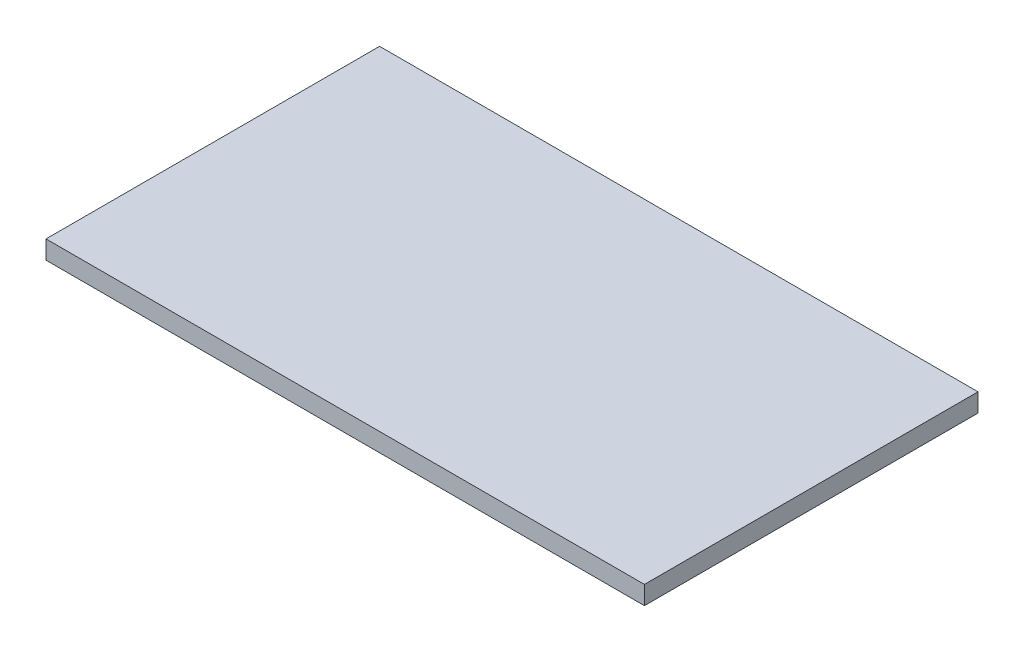
ISO-10303-21;
HEADER;
FILE_DESCRIPTION(('STEP AP214'),'2;1');
FILE_NAME('part.step','',(''),(''),'','','');
FILE_SCHEMA(('AUTOMOTIVE_DESIGN { 1 0 10303 214 1 1 1 1 }'));
ENDSEC;
DATA;
#1=APPLICATION_CONTEXT('core data for automotive mechanical design processes');
#2=APPLICATION_PROTOCOL_DEFINITION('international standard','automotive_design',2000,#1);
#3=PRODUCT_CONTEXT('',#1,'mechanical');
#4=PRODUCT('Part','Part','',(#3));
#5=PRODUCT_RELATED_PRODUCT_CATEGORY('part','',(#4));
#6=PRODUCT_DEFINITION_FORMATION('','',#4);
#7=PRODUCT_DEFINITION_CONTEXT('part definition',#1,'design');
#8=PRODUCT_DEFINITION('design','',#6,#7);
#9=PRODUCT_DEFINITION_SHAPE('','',#8);
#10=(LENGTH_UNIT() NAMED_UNIT(*) SI_UNIT(.MILLI.,.METRE.));
#11=(NAMED_UNIT(*) PLANE_ANGLE_UNIT() SI_UNIT($,.RADIAN.));
#12=(NAMED_UNIT(*) SI_UNIT($,.STERADIAN.) SOLID_ANGLE_UNIT());
#13=UNCERTAINTY_MEASURE_WITH_UNIT(LENGTH_MEASURE(1.E-05),#10,'distance_accuracy_value','');
#14=(GEOMETRIC_REPRESENTATION_CONTEXT(3) GLOBAL_UNCERTAINTY_ASSIGNED_CONTEXT((#13)) GLOBAL_UNIT_ASSIGNED_CONTEXT((#10,
#11,#12)) REPRESENTATION_CONTEXT('',''));
#15=CARTESIAN_POINT('',(0.,0.,0.));
#16=DIRECTION('',(0.,0.,1.));
#17=DIRECTION('',(1.,0.,0.));
#18=AXIS2_PLACEMENT_3D('',#15,#16,#17);
#19=CARTESIAN_POINT('',(-77.05,4.75,42.95));
#20=DIRECTION('',(1.,0.,0.));
#21=DIRECTION('',(0.,0.,-1.));
#22=AXIS2_PLACEMENT_3D('',#19,#20,#21);
#23=PLANE('',#22);
#24=DIRECTION('',(0.,0.,1.));
#25=VECTOR('',#24,1.);
#26=CARTESIAN_POINT('',(-77.05,0.,42.95));
#27=LINE('',#26,#25);
#28=CARTESIAN_POINT('',(-77.05,0.,-42.95));
#29=VERTEX_POINT('',#28);
#30=CARTESIAN_POINT('',(-77.05,0.,42.95));
#31=VERTEX_POINT('',#30);
#32=EDGE_CURVE('E95',#29,#31,#27,.T.);
#33=ORIENTED_EDGE('',*,*,#32,.T.);
#34=DIRECTION('',(0.,-1.,0.));
#35=VECTOR('',#34,1.);
#36=CARTESIAN_POINT('',(-77.05,4.75,42.95));
#37=LINE('',#36,#35);
#38=CARTESIAN_POINT('',(-77.05,4.75,42.95));
#39=VERTEX_POINT('',#38);
#40=EDGE_CURVE('E11',#39,#31,#37,.T.);
#41=ORIENTED_EDGE('',*,*,#40,.F.);
#42=DIRECTION('',(0.,0.,1.));
#43=VECTOR('',#42,1.);
#44=CARTESIAN_POINT('',(-77.05,4.75,42.95));
#45=LINE('',#44,#43);
#46=CARTESIAN_POINT('',(-77.05,4.75,-42.95));
#47=VERTEX_POINT('',#46);
#48=EDGE_CURVE('E83',#47,#39,#45,.T.);
#49=ORIENTED_EDGE('',*,*,#48,.F.);
#50=DIRECTION('',(0.,-1.,0.));
#51=VECTOR('',#50,1.);
#52=CARTESIAN_POINT('',(-77.05,4.75,-42.95));
#53=LINE('',#52,#51);
#54=EDGE_CURVE('E91',#47,#29,#53,.T.);
#55=ORIENTED_EDGE('',*,*,#54,.T.);
#56=EDGE_LOOP('',(#33,#41,#49,#55));
#57=FACE_BOUND('',#56,.T.);
#58=ADVANCED_FACE('F32',(#57),#23,.F.);
#59=CARTESIAN_POINT('',(-77.05,4.75,42.95));
#60=DIRECTION('',(0.,0.,-1.));
#61=DIRECTION('',(-1.,0.,0.));
#62=AXIS2_PLACEMENT_3D('',#59,#60,#61);
#63=PLANE('',#62);
#64=DIRECTION('',(1.,0.,0.));
#65=VECTOR('',#64,1.);
#66=CARTESIAN_POINT('',(-77.05,0.,42.95));
#67=LINE('',#66,#65);
#68=CARTESIAN_POINT('',(77.05,0.,42.95));
#69=VERTEX_POINT('',#68);
#70=EDGE_CURVE('E87',#31,#69,#67,.T.);
#71=ORIENTED_EDGE('',*,*,#70,.T.);
#72=DIRECTION('',(0.,-1.,0.));
#73=VECTOR('',#72,1.);
#74=CARTESIAN_POINT('',(77.05,4.75,42.95));
#75=LINE('',#74,#73);
#76=CARTESIAN_POINT('',(77.05,4.75,42.95));
#77=VERTEX_POINT('',#76);
#78=EDGE_CURVE('E40',#77,#69,#75,.T.);
#79=ORIENTED_EDGE('',*,*,#78,.F.);
#80=DIRECTION('',(1.,0.,0.));
#81=VECTOR('',#80,1.);
#82=CARTESIAN_POINT('',(-77.05,4.75,42.95));
#83=LINE('',#82,#81);
#84=EDGE_CURVE('E78',#39,#77,#83,.T.);
#85=ORIENTED_EDGE('',*,*,#84,.F.);
#86=ORIENTED_EDGE('',*,*,#40,.T.);
#87=EDGE_LOOP('',(#71,#79,#85,#86));
#88=FACE_BOUND('',#87,.T.);
#89=ADVANCED_FACE('F86',(#88),#63,.F.);
#90=CARTESIAN_POINT('',(77.05,4.75,42.95));
#91=DIRECTION('',(-1.,0.,0.));
#92=DIRECTION('',(0.,0.,1.));
#93=AXIS2_PLACEMENT_3D('',#90,#91,#92);
#94=PLANE('',#93);
#95=DIRECTION('',(0.,0.,-1.));
#96=VECTOR('',#95,1.);
#97=CARTESIAN_POINT('',(77.05,0.,42.95));
#98=LINE('',#97,#96);
#99=CARTESIAN_POINT('',(77.05,0.,-42.95));
#100=VERTEX_POINT('',#99);
#101=EDGE_CURVE('E65',#69,#100,#98,.T.);
#102=ORIENTED_EDGE('',*,*,#101,.T.);
#103=DIRECTION('',(0.,-1.,0.));
#104=VECTOR('',#103,1.);
#105=CARTESIAN_POINT('',(77.05,4.75,-42.95));
#106=LINE('',#105,#104);
#107=CARTESIAN_POINT('',(77.05,4.75,-42.95));
#108=VERTEX_POINT('',#107);
#109=EDGE_CURVE('E88',#108,#100,#106,.T.);
#110=ORIENTED_EDGE('',*,*,#109,.F.);
#111=DIRECTION('',(0.,0.,-1.));
#112=VECTOR('',#111,1.);
#113=CARTESIAN_POINT('',(77.05,4.75,42.95));
#114=LINE('',#113,#112);
#115=EDGE_CURVE('E81',#77,#108,#114,.T.);
#116=ORIENTED_EDGE('',*,*,#115,.F.);
#117=ORIENTED_EDGE('',*,*,#78,.T.);
#118=EDGE_LOOP('',(#102,#110,#116,#117));
#119=FACE_BOUND('',#118,.T.);
#120=ADVANCED_FACE('F89',(#119),#94,.F.);
#121=CARTESIAN_POINT('',(-77.05,4.75,-42.95));
#122=DIRECTION('',(0.,0.,1.));
#123=DIRECTION('',(1.,0.,0.));
#124=AXIS2_PLACEMENT_3D('',#121,#122,#123);
#125=PLANE('',#124);
#126=DIRECTION('',(-1.,0.,0.));
#127=VECTOR('',#126,1.);
#128=CARTESIAN_POINT('',(-77.05,0.,-42.95));
#129=LINE('',#128,#127);
#130=EDGE_CURVE('E71',#100,#29,#129,.T.);
#131=ORIENTED_EDGE('',*,*,#130,.T.);
#132=ORIENTED_EDGE('',*,*,#54,.F.);
#133=DIRECTION('',(-1.,0.,0.));
#134=VECTOR('',#133,1.);
#135=CARTESIAN_POINT('',(-77.05,4.75,-42.95));
#136=LINE('',#135,#134);
#137=EDGE_CURVE('E48',#108,#47,#136,.T.);
#138=ORIENTED_EDGE('',*,*,#137,.F.);
#139=ORIENTED_EDGE('',*,*,#109,.T.);
#140=EDGE_LOOP('',(#131,#132,#138,#139));
#141=FACE_BOUND('',#140,.T.);
#142=ADVANCED_FACE('F102',(#141),#125,.F.);
#143=CARTESIAN_POINT('',(0.,4.75,0.));
#144=DIRECTION('',(0.,-1.,0.));
#145=DIRECTION('',(0.,0.,-1.));
#146=AXIS2_PLACEMENT_3D('',#143,#144,#145);
#147=PLANE('',#146);
#148=ORIENTED_EDGE('',*,*,#48,.T.);
#149=ORIENTED_EDGE('',*,*,#84,.T.);
#150=ORIENTED_EDGE('',*,*,#115,.T.);
#151=ORIENTED_EDGE('',*,*,#137,.T.);
#152=EDGE_LOOP('',(#148,#149,#150,#151));
#153=FACE_BOUND('',#152,.T.);
#154=ADVANCED_FACE('F79',(#153),#147,.F.);
#155=CARTESIAN_POINT('',(0.,0.,0.));
#156=DIRECTION('',(0.,-1.,0.));
#157=DIRECTION('',(0.,0.,-1.));
#158=AXIS2_PLACEMENT_3D('',#155,#156,#157);
#159=PLANE('',#158);
#160=ORIENTED_EDGE('',*,*,#32,.F.);
#161=ORIENTED_EDGE('',*,*,#130,.F.);
#162=ORIENTED_EDGE('',*,*,#101,.F.);
#163=ORIENTED_EDGE('',*,*,#70,.F.);
#164=EDGE_LOOP('',(#160,#161,#162,#163));
#165=FACE_BOUND('',#164,.T.);
#166=ADVANCED_FACE('F105',(#165),#159,.T.);
#167=CLOSED_SHELL('',(#58,#89,#120,#142,#154,#166));
#168=MANIFOLD_SOLID_BREP('B2',#167);
#169=ADVANCED_BREP_SHAPE_REPRESENTATION('',(#18,#168),#14);
#170=SHAPE_DEFINITION_REPRESENTATION(#9,#169);
ENDSEC;
END-ISO-10303-21;
